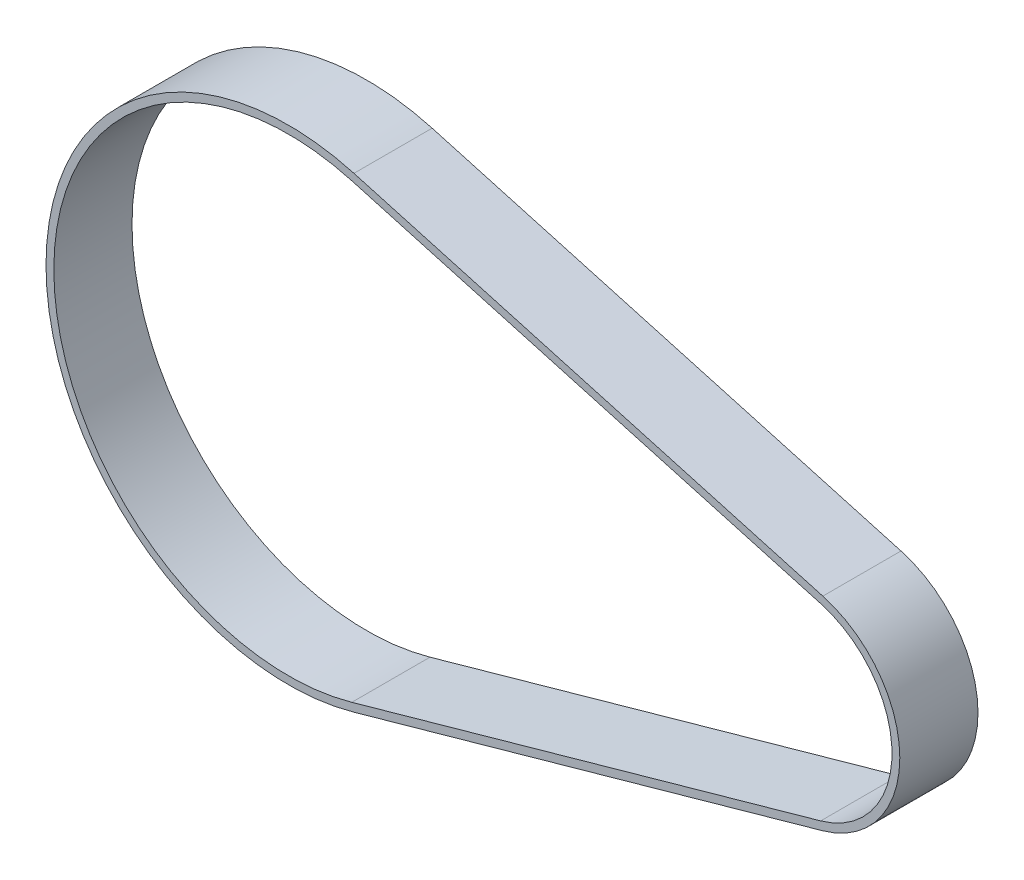
ISO-10303-21;
HEADER;
FILE_DESCRIPTION(('STEP AP214'),'2;1');
FILE_NAME('part.step','',(''),(''),'','','');
FILE_SCHEMA(('AUTOMOTIVE_DESIGN { 1 0 10303 214 1 1 1 1 }'));
ENDSEC;
DATA;
#1=APPLICATION_CONTEXT('core data for automotive mechanical design processes');
#2=APPLICATION_PROTOCOL_DEFINITION('international standard','automotive_design',2000,#1);
#3=PRODUCT_CONTEXT('',#1,'mechanical');
#4=PRODUCT('Part','Part','',(#3));
#5=PRODUCT_RELATED_PRODUCT_CATEGORY('part','',(#4));
#6=PRODUCT_DEFINITION_FORMATION('','',#4);
#7=PRODUCT_DEFINITION_CONTEXT('part definition',#1,'design');
#8=PRODUCT_DEFINITION('design','',#6,#7);
#9=PRODUCT_DEFINITION_SHAPE('','',#8);
#10=(LENGTH_UNIT() NAMED_UNIT(*) SI_UNIT(.MILLI.,.METRE.));
#11=(NAMED_UNIT(*) PLANE_ANGLE_UNIT() SI_UNIT($,.RADIAN.));
#12=(NAMED_UNIT(*) SI_UNIT($,.STERADIAN.) SOLID_ANGLE_UNIT());
#13=UNCERTAINTY_MEASURE_WITH_UNIT(LENGTH_MEASURE(1.E-05),#10,'distance_accuracy_value','');
#14=(GEOMETRIC_REPRESENTATION_CONTEXT(3) GLOBAL_UNCERTAINTY_ASSIGNED_CONTEXT((#13)) GLOBAL_UNIT_ASSIGNED_CONTEXT((#10,
#11,#12)) REPRESENTATION_CONTEXT('',''));
#15=CARTESIAN_POINT('',(0.,0.,0.));
#16=DIRECTION('',(0.,0.,1.));
#17=DIRECTION('',(1.,0.,0.));
#18=AXIS2_PLACEMENT_3D('',#15,#16,#17);
#19=CARTESIAN_POINT('',(0.,0.,10.));
#20=DIRECTION('',(0.,0.,1.));
#21=DIRECTION('',(1.,0.,0.));
#22=AXIS2_PLACEMENT_3D('',#19,#20,#21);
#23=PLANE('',#22);
#24=CARTESIAN_POINT('',(0.,0.,10.));
#25=DIRECTION('',(0.,0.,1.));
#26=DIRECTION('',(1.,0.,0.));
#27=AXIS2_PLACEMENT_3D('',#24,#25,#26);
#28=CIRCLE('',#27,13.5);
#29=CARTESIAN_POINT('',(3.6514683153014,-12.996798803642,10.));
#30=VERTEX_POINT('',#29);
#31=CARTESIAN_POINT('',(3.65146831530139,12.996798803642,10.));
#32=VERTEX_POINT('',#31);
#33=EDGE_CURVE('E142',#30,#32,#28,.T.);
#34=ORIENTED_EDGE('',*,*,#33,.T.);
#35=DIRECTION('',(-0.962725837306815,0.27047913446677,0.));
#36=VECTOR('',#35,1.);
#37=CARTESIAN_POINT('',(3.65146831530139,12.996798803642,10.));
#38=LINE('',#37,#36);
#39=CARTESIAN_POINT('',(-56.3151468315302,29.8445009565112,10.));
#40=VERTEX_POINT('',#39);
#41=EDGE_CURVE('E145',#32,#40,#38,.T.);
#42=ORIENTED_EDGE('',*,*,#41,.T.);
#43=CARTESIAN_POINT('',(-64.7,0.,10.));
#44=DIRECTION('',(0.,0.,1.));
#45=DIRECTION('',(1.,0.,0.));
#46=AXIS2_PLACEMENT_3D('',#43,#44,#45);
#47=CIRCLE('',#46,31.);
#48=CARTESIAN_POINT('',(-56.3151468315301,-29.8445009565112,10.));
#49=VERTEX_POINT('',#48);
#50=EDGE_CURVE('E147',#40,#49,#47,.T.);
#51=ORIENTED_EDGE('',*,*,#50,.T.);
#52=DIRECTION('',(0.962725837306814,0.27047913446677,0.));
#53=VECTOR('',#52,1.);
#54=CARTESIAN_POINT('',(-56.3151468315301,-29.8445009565113,10.));
#55=LINE('',#54,#53);
#56=EDGE_CURVE('E149',#49,#30,#55,.T.);
#57=ORIENTED_EDGE('',*,*,#56,.T.);
#58=EDGE_LOOP('',(#34,#42,#51,#57));
#59=FACE_BOUND('',#58,.T.);
#60=DIRECTION('',(-0.962725837306814,0.27047913446677,0.));
#61=VECTOR('',#60,1.);
#62=CARTESIAN_POINT('',(3.38098918083462,12.0340729663352,10.));
#63=LINE('',#62,#61);
#64=CARTESIAN_POINT('',(3.38098918083462,12.0340729663352,10.));
#65=VERTEX_POINT('',#64);
#66=CARTESIAN_POINT('',(-56.5856259659969,28.8817751192044,10.));
#67=VERTEX_POINT('',#66);
#68=EDGE_CURVE('E124',#65,#67,#63,.T.);
#69=ORIENTED_EDGE('',*,*,#68,.F.);
#70=CARTESIAN_POINT('',(0.,0.,10.));
#71=DIRECTION('',(0.,0.,1.));
#72=DIRECTION('',(1.,0.,0.));
#73=AXIS2_PLACEMENT_3D('',#70,#71,#72);
#74=CIRCLE('',#73,12.5);
#75=CARTESIAN_POINT('',(3.38098918083462,-12.0340729663352,10.));
#76=VERTEX_POINT('',#75);
#77=EDGE_CURVE('E113',#76,#65,#74,.T.);
#78=ORIENTED_EDGE('',*,*,#77,.F.);
#79=DIRECTION('',(0.962725837306815,0.27047913446677,0.));
#80=VECTOR('',#79,1.);
#81=CARTESIAN_POINT('',(-56.5856259659969,-28.8817751192044,10.));
#82=LINE('',#81,#80);
#83=CARTESIAN_POINT('',(-56.5856259659969,-28.8817751192044,10.));
#84=VERTEX_POINT('',#83);
#85=EDGE_CURVE('E128',#84,#76,#82,.T.);
#86=ORIENTED_EDGE('',*,*,#85,.F.);
#87=CARTESIAN_POINT('',(-64.7,0.,10.));
#88=DIRECTION('',(0.,0.,1.));
#89=DIRECTION('',(1.,0.,0.));
#90=AXIS2_PLACEMENT_3D('',#87,#88,#89);
#91=CIRCLE('',#90,30.);
#92=EDGE_CURVE('E126',#67,#84,#91,.T.);
#93=ORIENTED_EDGE('',*,*,#92,.F.);
#94=EDGE_LOOP('',(#69,#78,#86,#93));
#95=FACE_BOUND('',#94,.T.);
#96=ADVANCED_FACE('F33',(#59,#95),#23,.T.);
#97=CARTESIAN_POINT('',(0.,0.,0.));
#98=DIRECTION('',(0.,0.,1.));
#99=DIRECTION('',(1.,0.,0.));
#100=AXIS2_PLACEMENT_3D('',#97,#98,#99);
#101=PLANE('',#100);
#102=CARTESIAN_POINT('',(0.,0.,0.));
#103=DIRECTION('',(0.,0.,1.));
#104=DIRECTION('',(1.,0.,0.));
#105=AXIS2_PLACEMENT_3D('',#102,#103,#104);
#106=CIRCLE('',#105,13.5);
#107=CARTESIAN_POINT('',(3.6514683153014,-12.996798803642,0.));
#108=VERTEX_POINT('',#107);
#109=CARTESIAN_POINT('',(3.65146831530139,12.996798803642,0.));
#110=VERTEX_POINT('',#109);
#111=EDGE_CURVE('E114',#108,#110,#106,.T.);
#112=ORIENTED_EDGE('',*,*,#111,.F.);
#113=DIRECTION('',(0.962725837306814,0.27047913446677,0.));
#114=VECTOR('',#113,1.);
#115=CARTESIAN_POINT('',(-56.3151468315301,-29.8445009565113,0.));
#116=LINE('',#115,#114);
#117=CARTESIAN_POINT('',(-56.3151468315301,-29.8445009565112,0.));
#118=VERTEX_POINT('',#117);
#119=EDGE_CURVE('E140',#118,#108,#116,.T.);
#120=ORIENTED_EDGE('',*,*,#119,.F.);
#121=CARTESIAN_POINT('',(-64.7,0.,0.));
#122=DIRECTION('',(0.,0.,1.));
#123=DIRECTION('',(1.,0.,0.));
#124=AXIS2_PLACEMENT_3D('',#121,#122,#123);
#125=CIRCLE('',#124,31.);
#126=CARTESIAN_POINT('',(-56.3151468315302,29.8445009565112,0.));
#127=VERTEX_POINT('',#126);
#128=EDGE_CURVE('E138',#127,#118,#125,.T.);
#129=ORIENTED_EDGE('',*,*,#128,.F.);
#130=DIRECTION('',(-0.962725837306815,0.27047913446677,0.));
#131=VECTOR('',#130,1.);
#132=CARTESIAN_POINT('',(3.65146831530139,12.996798803642,0.));
#133=LINE('',#132,#131);
#134=EDGE_CURVE('E136',#110,#127,#133,.T.);
#135=ORIENTED_EDGE('',*,*,#134,.F.);
#136=EDGE_LOOP('',(#112,#120,#129,#135));
#137=FACE_BOUND('',#136,.T.);
#138=CARTESIAN_POINT('',(0.,0.,0.));
#139=DIRECTION('',(0.,0.,1.));
#140=DIRECTION('',(1.,0.,0.));
#141=AXIS2_PLACEMENT_3D('',#138,#139,#140);
#142=CIRCLE('',#141,12.5);
#143=CARTESIAN_POINT('',(3.38098918083462,-12.0340729663352,0.));
#144=VERTEX_POINT('',#143);
#145=CARTESIAN_POINT('',(3.38098918083462,12.0340729663352,0.));
#146=VERTEX_POINT('',#145);
#147=EDGE_CURVE('E56',#144,#146,#142,.T.);
#148=ORIENTED_EDGE('',*,*,#147,.T.);
#149=DIRECTION('',(-0.962725837306814,0.27047913446677,0.));
#150=VECTOR('',#149,1.);
#151=CARTESIAN_POINT('',(3.38098918083462,12.0340729663352,0.));
#152=LINE('',#151,#150);
#153=CARTESIAN_POINT('',(-56.5856259659969,28.8817751192044,0.));
#154=VERTEX_POINT('',#153);
#155=EDGE_CURVE('E100',#146,#154,#152,.T.);
#156=ORIENTED_EDGE('',*,*,#155,.T.);
#157=CARTESIAN_POINT('',(-64.7,0.,0.));
#158=DIRECTION('',(0.,0.,1.));
#159=DIRECTION('',(1.,0.,0.));
#160=AXIS2_PLACEMENT_3D('',#157,#158,#159);
#161=CIRCLE('',#160,30.);
#162=CARTESIAN_POINT('',(-56.5856259659969,-28.8817751192044,0.));
#163=VERTEX_POINT('',#162);
#164=EDGE_CURVE('E109',#154,#163,#161,.T.);
#165=ORIENTED_EDGE('',*,*,#164,.T.);
#166=DIRECTION('',(0.962725837306815,0.27047913446677,0.));
#167=VECTOR('',#166,1.);
#168=CARTESIAN_POINT('',(-56.5856259659969,-28.8817751192044,0.));
#169=LINE('',#168,#167);
#170=EDGE_CURVE('E118',#163,#144,#169,.T.);
#171=ORIENTED_EDGE('',*,*,#170,.T.);
#172=EDGE_LOOP('',(#148,#156,#165,#171));
#173=FACE_BOUND('',#172,.T.);
#174=ADVANCED_FACE('F117',(#137,#173),#101,.F.);
#175=CARTESIAN_POINT('',(0.,0.,10.));
#176=DIRECTION('',(0.,0.,-1.));
#177=DIRECTION('',(-1.,0.,0.));
#178=AXIS2_PLACEMENT_3D('',#175,#176,#177);
#179=CYLINDRICAL_SURFACE('',#178,13.5);
#180=ORIENTED_EDGE('',*,*,#111,.T.);
#181=DIRECTION('',(0.,0.,-1.));
#182=VECTOR('',#181,1.);
#183=CARTESIAN_POINT('',(3.65146831530139,12.996798803642,10.));
#184=LINE('',#183,#182);
#185=EDGE_CURVE('E11',#32,#110,#184,.T.);
#186=ORIENTED_EDGE('',*,*,#185,.F.);
#187=ORIENTED_EDGE('',*,*,#33,.F.);
#188=DIRECTION('',(0.,0.,-1.));
#189=VECTOR('',#188,1.);
#190=CARTESIAN_POINT('',(3.6514683153014,-12.996798803642,10.));
#191=LINE('',#190,#189);
#192=EDGE_CURVE('E151',#30,#108,#191,.T.);
#193=ORIENTED_EDGE('',*,*,#192,.T.);
#194=EDGE_LOOP('',(#180,#186,#187,#193));
#195=FACE_BOUND('',#194,.T.);
#196=ADVANCED_FACE('F35',(#195),#179,.T.);
#197=CARTESIAN_POINT('',(3.65146831530139,12.996798803642,10.));
#198=DIRECTION('',(-0.270479134466769,-0.962725837306815,0.));
#199=DIRECTION('',(0.962725837306815,-0.270479134466769,0.));
#200=AXIS2_PLACEMENT_3D('',#197,#198,#199);
#201=PLANE('',#200);
#202=ORIENTED_EDGE('',*,*,#134,.T.);
#203=DIRECTION('',(0.,0.,-1.));
#204=VECTOR('',#203,1.);
#205=CARTESIAN_POINT('',(-56.3151468315302,29.8445009565112,10.));
#206=LINE('',#205,#204);
#207=EDGE_CURVE('E41',#40,#127,#206,.T.);
#208=ORIENTED_EDGE('',*,*,#207,.F.);
#209=ORIENTED_EDGE('',*,*,#41,.F.);
#210=ORIENTED_EDGE('',*,*,#185,.T.);
#211=EDGE_LOOP('',(#202,#208,#209,#210));
#212=FACE_BOUND('',#211,.T.);
#213=ADVANCED_FACE('F176',(#212),#201,.F.);
#214=CARTESIAN_POINT('',(-64.7,0.,10.));
#215=DIRECTION('',(0.,0.,-1.));
#216=DIRECTION('',(-1.,0.,0.));
#217=AXIS2_PLACEMENT_3D('',#214,#215,#216);
#218=CYLINDRICAL_SURFACE('',#217,31.);
#219=ORIENTED_EDGE('',*,*,#128,.T.);
#220=DIRECTION('',(0.,0.,-1.));
#221=VECTOR('',#220,1.);
#222=CARTESIAN_POINT('',(-56.3151468315301,-29.8445009565112,10.));
#223=LINE('',#222,#221);
#224=EDGE_CURVE('E154',#49,#118,#223,.T.);
#225=ORIENTED_EDGE('',*,*,#224,.F.);
#226=ORIENTED_EDGE('',*,*,#50,.F.);
#227=ORIENTED_EDGE('',*,*,#207,.T.);
#228=EDGE_LOOP('',(#219,#225,#226,#227));
#229=FACE_BOUND('',#228,.T.);
#230=ADVANCED_FACE('F161',(#229),#218,.T.);
#231=CARTESIAN_POINT('',(-56.3151468315301,-29.8445009565113,10.));
#232=DIRECTION('',(-0.27047913446677,0.962725837306815,0.));
#233=DIRECTION('',(-0.962725837306815,-0.27047913446677,0.));
#234=AXIS2_PLACEMENT_3D('',#231,#232,#233);
#235=PLANE('',#234);
#236=ORIENTED_EDGE('',*,*,#119,.T.);
#237=ORIENTED_EDGE('',*,*,#192,.F.);
#238=ORIENTED_EDGE('',*,*,#56,.F.);
#239=ORIENTED_EDGE('',*,*,#224,.T.);
#240=EDGE_LOOP('',(#236,#237,#238,#239));
#241=FACE_BOUND('',#240,.T.);
#242=ADVANCED_FACE('F169',(#241),#235,.F.);
#243=CARTESIAN_POINT('',(0.,0.,10.));
#244=DIRECTION('',(0.,0.,-1.));
#245=DIRECTION('',(-1.,0.,0.));
#246=AXIS2_PLACEMENT_3D('',#243,#244,#245);
#247=CYLINDRICAL_SURFACE('',#246,12.5);
#248=ORIENTED_EDGE('',*,*,#147,.F.);
#249=DIRECTION('',(0.,0.,-1.));
#250=VECTOR('',#249,1.);
#251=CARTESIAN_POINT('',(3.38098918083462,-12.0340729663352,10.));
#252=LINE('',#251,#250);
#253=EDGE_CURVE('E130',#76,#144,#252,.T.);
#254=ORIENTED_EDGE('',*,*,#253,.F.);
#255=ORIENTED_EDGE('',*,*,#77,.T.);
#256=DIRECTION('',(0.,0.,-1.));
#257=VECTOR('',#256,1.);
#258=CARTESIAN_POINT('',(3.38098918083462,12.0340729663352,10.));
#259=LINE('',#258,#257);
#260=EDGE_CURVE('E102',#65,#146,#259,.T.);
#261=ORIENTED_EDGE('',*,*,#260,.T.);
#262=EDGE_LOOP('',(#248,#254,#255,#261));
#263=FACE_BOUND('',#262,.T.);
#264=ADVANCED_FACE('F111',(#263),#247,.F.);
#265=CARTESIAN_POINT('',(3.38098918083462,12.0340729663352,10.));
#266=DIRECTION('',(-0.27047913446677,-0.962725837306815,0.));
#267=DIRECTION('',(0.962725837306815,-0.27047913446677,0.));
#268=AXIS2_PLACEMENT_3D('',#265,#266,#267);
#269=PLANE('',#268);
#270=ORIENTED_EDGE('',*,*,#155,.F.);
#271=ORIENTED_EDGE('',*,*,#260,.F.);
#272=ORIENTED_EDGE('',*,*,#68,.T.);
#273=DIRECTION('',(0.,0.,-1.));
#274=VECTOR('',#273,1.);
#275=CARTESIAN_POINT('',(-56.5856259659969,28.8817751192044,10.));
#276=LINE('',#275,#274);
#277=EDGE_CURVE('E105',#67,#154,#276,.T.);
#278=ORIENTED_EDGE('',*,*,#277,.T.);
#279=EDGE_LOOP('',(#270,#271,#272,#278));
#280=FACE_BOUND('',#279,.T.);
#281=ADVANCED_FACE('F101',(#280),#269,.T.);
#282=CARTESIAN_POINT('',(-64.7,0.,10.));
#283=DIRECTION('',(0.,0.,-1.));
#284=DIRECTION('',(-1.,0.,0.));
#285=AXIS2_PLACEMENT_3D('',#282,#283,#284);
#286=CYLINDRICAL_SURFACE('',#285,30.);
#287=ORIENTED_EDGE('',*,*,#164,.F.);
#288=ORIENTED_EDGE('',*,*,#277,.F.);
#289=ORIENTED_EDGE('',*,*,#92,.T.);
#290=DIRECTION('',(0.,0.,-1.));
#291=VECTOR('',#290,1.);
#292=CARTESIAN_POINT('',(-56.5856259659969,-28.8817751192044,10.));
#293=LINE('',#292,#291);
#294=EDGE_CURVE('E48',#84,#163,#293,.T.);
#295=ORIENTED_EDGE('',*,*,#294,.T.);
#296=EDGE_LOOP('',(#287,#288,#289,#295));
#297=FACE_BOUND('',#296,.T.);
#298=ADVANCED_FACE('F198',(#297),#286,.F.);
#299=CARTESIAN_POINT('',(-56.5856259659969,-28.8817751192044,10.));
#300=DIRECTION('',(-0.270479134466769,0.962725837306815,0.));
#301=DIRECTION('',(-0.962725837306815,-0.270479134466769,0.));
#302=AXIS2_PLACEMENT_3D('',#299,#300,#301);
#303=PLANE('',#302);
#304=ORIENTED_EDGE('',*,*,#170,.F.);
#305=ORIENTED_EDGE('',*,*,#294,.F.);
#306=ORIENTED_EDGE('',*,*,#85,.T.);
#307=ORIENTED_EDGE('',*,*,#253,.T.);
#308=EDGE_LOOP('',(#304,#305,#306,#307));
#309=FACE_BOUND('',#308,.T.);
#310=ADVANCED_FACE('F203',(#309),#303,.T.);
#311=CLOSED_SHELL('',(#96,#174,#196,#213,#230,#242,#264,#281,#298,#310));
#312=MANIFOLD_SOLID_BREP('B2',#311);
#313=ADVANCED_BREP_SHAPE_REPRESENTATION('',(#18,#312),#14);
#314=SHAPE_DEFINITION_REPRESENTATION(#9,#313);
ENDSEC;
END-ISO-10303-21;
